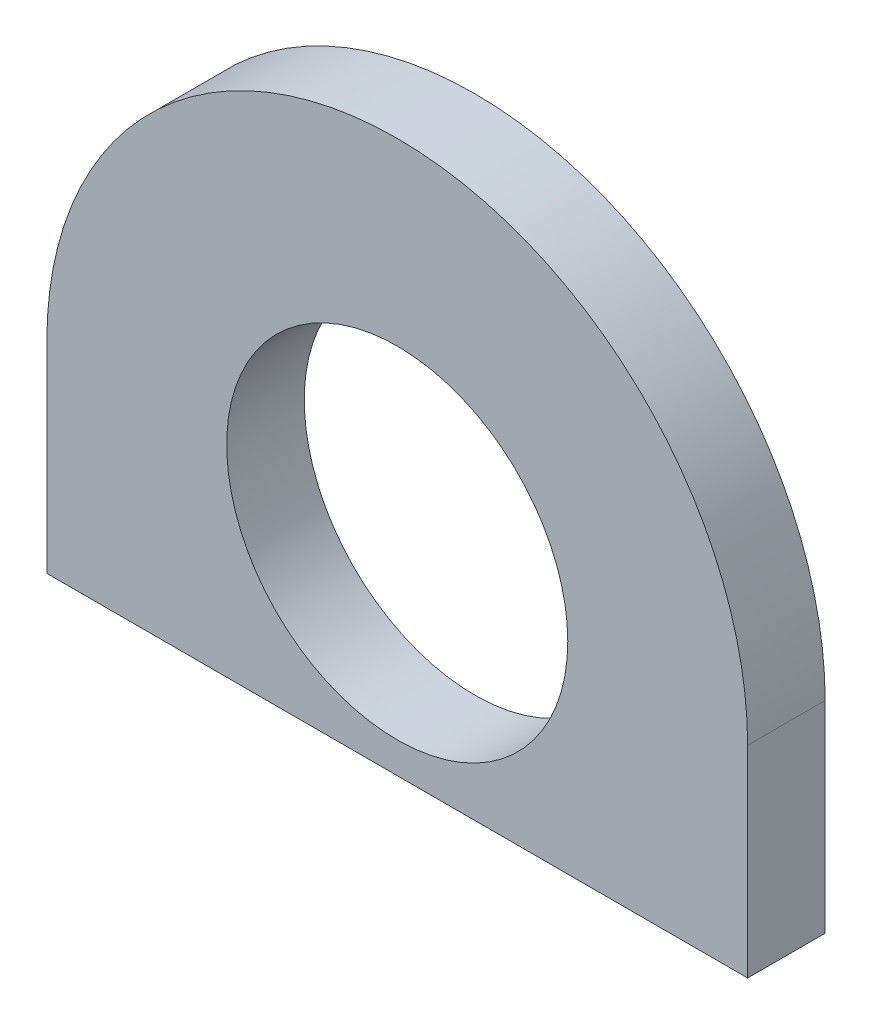
ISO-10303-21;
HEADER;
FILE_DESCRIPTION(('STEP AP214'),'2;1');
FILE_NAME('part.step','',(''),(''),'','','');
FILE_SCHEMA(('AUTOMOTIVE_DESIGN { 1 0 10303 214 1 1 1 1 }'));
ENDSEC;
DATA;
#1=APPLICATION_CONTEXT('core data for automotive mechanical design processes');
#2=APPLICATION_PROTOCOL_DEFINITION('international standard','automotive_design',2000,#1);
#3=PRODUCT_CONTEXT('',#1,'mechanical');
#4=PRODUCT('Part','Part','',(#3));
#5=PRODUCT_RELATED_PRODUCT_CATEGORY('part','',(#4));
#6=PRODUCT_DEFINITION_FORMATION('','',#4);
#7=PRODUCT_DEFINITION_CONTEXT('part definition',#1,'design');
#8=PRODUCT_DEFINITION('design','',#6,#7);
#9=PRODUCT_DEFINITION_SHAPE('','',#8);
#10=(LENGTH_UNIT() NAMED_UNIT(*) SI_UNIT(.MILLI.,.METRE.));
#11=(NAMED_UNIT(*) PLANE_ANGLE_UNIT() SI_UNIT($,.RADIAN.));
#12=(NAMED_UNIT(*) SI_UNIT($,.STERADIAN.) SOLID_ANGLE_UNIT());
#13=UNCERTAINTY_MEASURE_WITH_UNIT(LENGTH_MEASURE(1.E-05),#10,'distance_accuracy_value','');
#14=(GEOMETRIC_REPRESENTATION_CONTEXT(3) GLOBAL_UNCERTAINTY_ASSIGNED_CONTEXT((#13)) GLOBAL_UNIT_ASSIGNED_CONTEXT((#10,
#11,#12)) REPRESENTATION_CONTEXT('',''));
#15=CARTESIAN_POINT('',(0.,0.,0.));
#16=DIRECTION('',(0.,0.,1.));
#17=DIRECTION('',(1.,0.,0.));
#18=AXIS2_PLACEMENT_3D('',#15,#16,#17);
#19=CARTESIAN_POINT('',(0.,0.,5.));
#20=DIRECTION('',(0.,0.,1.));
#21=DIRECTION('',(1.,0.,0.));
#22=AXIS2_PLACEMENT_3D('',#19,#20,#21);
#23=PLANE('',#22);
#24=CARTESIAN_POINT('',(0.,0.,5.));
#25=DIRECTION('',(0.,0.,1.));
#26=DIRECTION('',(1.,0.,0.));
#27=AXIS2_PLACEMENT_3D('',#24,#25,#26);
#28=CIRCLE('',#27,22.6);
#29=CARTESIAN_POINT('',(22.6,0.,5.));
#30=VERTEX_POINT('',#29);
#31=CARTESIAN_POINT('',(-22.6,0.,5.));
#32=VERTEX_POINT('',#31);
#33=EDGE_CURVE('E83',#30,#32,#28,.T.);
#34=ORIENTED_EDGE('',*,*,#33,.T.);
#35=DIRECTION('',(0.,-1.,0.));
#36=VECTOR('',#35,1.);
#37=CARTESIAN_POINT('',(-22.6,-13.,5.));
#38=LINE('',#37,#36);
#39=CARTESIAN_POINT('',(-22.6,-13.,5.));
#40=VERTEX_POINT('',#39);
#41=EDGE_CURVE('E78',#32,#40,#38,.T.);
#42=ORIENTED_EDGE('',*,*,#41,.T.);
#43=DIRECTION('',(1.,0.,0.));
#44=VECTOR('',#43,1.);
#45=CARTESIAN_POINT('',(22.6,-13.,5.));
#46=LINE('',#45,#44);
#47=CARTESIAN_POINT('',(22.6,-13.,5.));
#48=VERTEX_POINT('',#47);
#49=EDGE_CURVE('E81',#40,#48,#46,.T.);
#50=ORIENTED_EDGE('',*,*,#49,.T.);
#51=DIRECTION('',(0.,1.,0.));
#52=VECTOR('',#51,1.);
#53=CARTESIAN_POINT('',(22.6,-13.,5.));
#54=LINE('',#53,#52);
#55=EDGE_CURVE('E48',#48,#30,#54,.T.);
#56=ORIENTED_EDGE('',*,*,#55,.T.);
#57=EDGE_LOOP('',(#34,#42,#50,#56));
#58=FACE_BOUND('',#57,.T.);
#59=CARTESIAN_POINT('',(0.,0.,5.));
#60=DIRECTION('',(0.,0.,1.));
#61=DIRECTION('',(1.,0.,0.));
#62=AXIS2_PLACEMENT_3D('',#59,#60,#61);
#63=CIRCLE('',#62,11.);
#64=CARTESIAN_POINT('',(11.,0.,5.));
#65=VERTEX_POINT('',#64);
#66=EDGE_CURVE('E98',#65,#65,#63,.T.);
#67=ORIENTED_EDGE('',*,*,#66,.F.);
#68=EDGE_LOOP('',(#67));
#69=FACE_BOUND('',#68,.T.);
#70=ADVANCED_FACE('F31',(#58,#69),#23,.T.);
#71=CARTESIAN_POINT('',(0.,0.,0.));
#72=DIRECTION('',(0.,0.,1.));
#73=DIRECTION('',(1.,0.,0.));
#74=AXIS2_PLACEMENT_3D('',#71,#72,#73);
#75=PLANE('',#74);
#76=CARTESIAN_POINT('',(0.,0.,0.));
#77=DIRECTION('',(0.,0.,1.));
#78=DIRECTION('',(1.,0.,0.));
#79=AXIS2_PLACEMENT_3D('',#76,#77,#78);
#80=CIRCLE('',#79,22.6);
#81=CARTESIAN_POINT('',(22.6,0.,0.));
#82=VERTEX_POINT('',#81);
#83=CARTESIAN_POINT('',(-22.6,0.,0.));
#84=VERTEX_POINT('',#83);
#85=EDGE_CURVE('E95',#82,#84,#80,.T.);
#86=ORIENTED_EDGE('',*,*,#85,.F.);
#87=DIRECTION('',(0.,1.,0.));
#88=VECTOR('',#87,1.);
#89=CARTESIAN_POINT('',(22.6,-13.,0.));
#90=LINE('',#89,#88);
#91=CARTESIAN_POINT('',(22.6,-13.,0.));
#92=VERTEX_POINT('',#91);
#93=EDGE_CURVE('E71',#92,#82,#90,.T.);
#94=ORIENTED_EDGE('',*,*,#93,.F.);
#95=DIRECTION('',(1.,0.,0.));
#96=VECTOR('',#95,1.);
#97=CARTESIAN_POINT('',(22.6,-13.,0.));
#98=LINE('',#97,#96);
#99=CARTESIAN_POINT('',(-22.6,-13.,0.));
#100=VERTEX_POINT('',#99);
#101=EDGE_CURVE('E65',#100,#92,#98,.T.);
#102=ORIENTED_EDGE('',*,*,#101,.F.);
#103=DIRECTION('',(0.,-1.,0.));
#104=VECTOR('',#103,1.);
#105=CARTESIAN_POINT('',(-22.6,-13.,0.));
#106=LINE('',#105,#104);
#107=EDGE_CURVE('E87',#84,#100,#106,.T.);
#108=ORIENTED_EDGE('',*,*,#107,.F.);
#109=EDGE_LOOP('',(#86,#94,#102,#108));
#110=FACE_BOUND('',#109,.T.);
#111=CARTESIAN_POINT('',(0.,0.,0.));
#112=DIRECTION('',(0.,0.,1.));
#113=DIRECTION('',(1.,0.,0.));
#114=AXIS2_PLACEMENT_3D('',#111,#112,#113);
#115=CIRCLE('',#114,11.);
#116=CARTESIAN_POINT('',(11.,0.,0.));
#117=VERTEX_POINT('',#116);
#118=EDGE_CURVE('E110',#117,#117,#115,.T.);
#119=ORIENTED_EDGE('',*,*,#118,.T.);
#120=EDGE_LOOP('',(#119));
#121=FACE_BOUND('',#120,.T.);
#122=ADVANCED_FACE('F106',(#110,#121),#75,.F.);
#123=CARTESIAN_POINT('',(0.,0.,5.));
#124=DIRECTION('',(0.,0.,-1.));
#125=DIRECTION('',(-1.,0.,0.));
#126=AXIS2_PLACEMENT_3D('',#123,#124,#125);
#127=CYLINDRICAL_SURFACE('',#126,22.6);
#128=ORIENTED_EDGE('',*,*,#85,.T.);
#129=DIRECTION('',(0.,0.,-1.));
#130=VECTOR('',#129,1.);
#131=CARTESIAN_POINT('',(-22.6,0.,5.));
#132=LINE('',#131,#130);
#133=EDGE_CURVE('E11',#32,#84,#132,.T.);
#134=ORIENTED_EDGE('',*,*,#133,.F.);
#135=ORIENTED_EDGE('',*,*,#33,.F.);
#136=DIRECTION('',(0.,0.,-1.));
#137=VECTOR('',#136,1.);
#138=CARTESIAN_POINT('',(22.6,0.,5.));
#139=LINE('',#138,#137);
#140=EDGE_CURVE('E91',#30,#82,#139,.T.);
#141=ORIENTED_EDGE('',*,*,#140,.T.);
#142=EDGE_LOOP('',(#128,#134,#135,#141));
#143=FACE_BOUND('',#142,.T.);
#144=ADVANCED_FACE('F33',(#143),#127,.T.);
#145=CARTESIAN_POINT('',(-22.6,-13.,5.));
#146=DIRECTION('',(1.,0.,0.));
#147=DIRECTION('',(0.,1.,0.));
#148=AXIS2_PLACEMENT_3D('',#145,#146,#147);
#149=PLANE('',#148);
#150=ORIENTED_EDGE('',*,*,#107,.T.);
#151=DIRECTION('',(0.,0.,-1.));
#152=VECTOR('',#151,1.);
#153=CARTESIAN_POINT('',(-22.6,-13.,5.));
#154=LINE('',#153,#152);
#155=EDGE_CURVE('E40',#40,#100,#154,.T.);
#156=ORIENTED_EDGE('',*,*,#155,.F.);
#157=ORIENTED_EDGE('',*,*,#41,.F.);
#158=ORIENTED_EDGE('',*,*,#133,.T.);
#159=EDGE_LOOP('',(#150,#156,#157,#158));
#160=FACE_BOUND('',#159,.T.);
#161=ADVANCED_FACE('F86',(#160),#149,.F.);
#162=CARTESIAN_POINT('',(22.6,-13.,5.));
#163=DIRECTION('',(0.,1.,0.));
#164=DIRECTION('',(-1.,0.,0.));
#165=AXIS2_PLACEMENT_3D('',#162,#163,#164);
#166=PLANE('',#165);
#167=ORIENTED_EDGE('',*,*,#101,.T.);
#168=DIRECTION('',(0.,0.,-1.));
#169=VECTOR('',#168,1.);
#170=CARTESIAN_POINT('',(22.6,-13.,5.));
#171=LINE('',#170,#169);
#172=EDGE_CURVE('E88',#48,#92,#171,.T.);
#173=ORIENTED_EDGE('',*,*,#172,.F.);
#174=ORIENTED_EDGE('',*,*,#49,.F.);
#175=ORIENTED_EDGE('',*,*,#155,.T.);
#176=EDGE_LOOP('',(#167,#173,#174,#175));
#177=FACE_BOUND('',#176,.T.);
#178=ADVANCED_FACE('F89',(#177),#166,.F.);
#179=CARTESIAN_POINT('',(22.6,-13.,5.));
#180=DIRECTION('',(-1.,0.,0.));
#181=DIRECTION('',(0.,0.,1.));
#182=AXIS2_PLACEMENT_3D('',#179,#180,#181);
#183=PLANE('',#182);
#184=ORIENTED_EDGE('',*,*,#93,.T.);
#185=ORIENTED_EDGE('',*,*,#140,.F.);
#186=ORIENTED_EDGE('',*,*,#55,.F.);
#187=ORIENTED_EDGE('',*,*,#172,.T.);
#188=EDGE_LOOP('',(#184,#185,#186,#187));
#189=FACE_BOUND('',#188,.T.);
#190=ADVANCED_FACE('F103',(#189),#183,.F.);
#191=CARTESIAN_POINT('',(0.,0.,5.));
#192=DIRECTION('',(0.,0.,-1.));
#193=DIRECTION('',(-1.,0.,0.));
#194=AXIS2_PLACEMENT_3D('',#191,#192,#193);
#195=CYLINDRICAL_SURFACE('',#194,11.);
#196=ORIENTED_EDGE('',*,*,#66,.T.);
#197=EDGE_LOOP('',(#196));
#198=FACE_BOUND('',#197,.T.);
#199=ORIENTED_EDGE('',*,*,#118,.F.);
#200=EDGE_LOOP('',(#199));
#201=FACE_BOUND('',#200,.T.);
#202=ADVANCED_FACE('F116',(#198,#201),#195,.F.);
#203=CLOSED_SHELL('',(#70,#122,#144,#161,#178,#190,#202));
#204=MANIFOLD_SOLID_BREP('B2',#203);
#205=ADVANCED_BREP_SHAPE_REPRESENTATION('',(#18,#204),#14);
#206=SHAPE_DEFINITION_REPRESENTATION(#9,#205);
ENDSEC;
END-ISO-10303-21;
